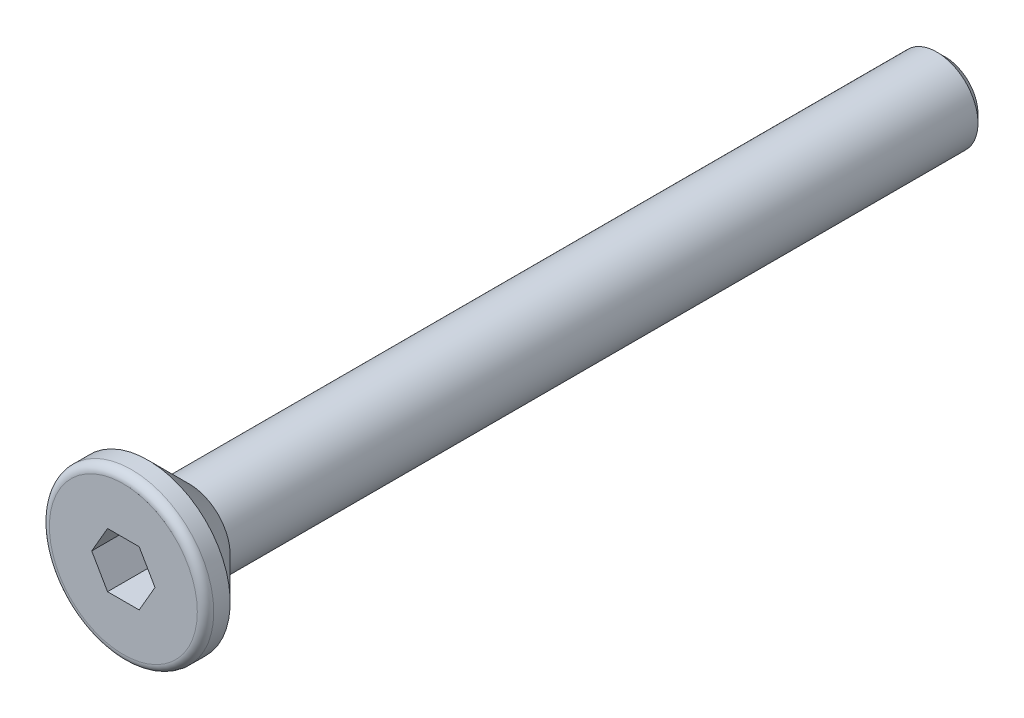
ISO-10303-21;
HEADER;
FILE_DESCRIPTION(('STEP AP214'),'2;1');
FILE_NAME('part.step','',(''),(''),'','','');
FILE_SCHEMA(('AUTOMOTIVE_DESIGN { 1 0 10303 214 1 1 1 1 }'));
ENDSEC;
DATA;
#1=APPLICATION_CONTEXT('core data for automotive mechanical design processes');
#2=APPLICATION_PROTOCOL_DEFINITION('international standard','automotive_design',2000,#1);
#3=PRODUCT_CONTEXT('',#1,'mechanical');
#4=PRODUCT('Part','Part','',(#3));
#5=PRODUCT_RELATED_PRODUCT_CATEGORY('part','',(#4));
#6=PRODUCT_DEFINITION_FORMATION('','',#4);
#7=PRODUCT_DEFINITION_CONTEXT('part definition',#1,'design');
#8=PRODUCT_DEFINITION('design','',#6,#7);
#9=PRODUCT_DEFINITION_SHAPE('','',#8);
#10=(LENGTH_UNIT() NAMED_UNIT(*) SI_UNIT(.MILLI.,.METRE.));
#11=(NAMED_UNIT(*) PLANE_ANGLE_UNIT() SI_UNIT($,.RADIAN.));
#12=(NAMED_UNIT(*) SI_UNIT($,.STERADIAN.) SOLID_ANGLE_UNIT());
#13=UNCERTAINTY_MEASURE_WITH_UNIT(LENGTH_MEASURE(1.E-05),#10,'distance_accuracy_value','');
#14=(GEOMETRIC_REPRESENTATION_CONTEXT(3) GLOBAL_UNCERTAINTY_ASSIGNED_CONTEXT((#13)) GLOBAL_UNIT_ASSIGNED_CONTEXT((#10,
#11,#12)) REPRESENTATION_CONTEXT('',''));
#15=CARTESIAN_POINT('',(0.,0.,0.));
#16=DIRECTION('',(0.,0.,1.));
#17=DIRECTION('',(1.,0.,0.));
#18=AXIS2_PLACEMENT_3D('',#15,#16,#17);
#19=CARTESIAN_POINT('',(0.,0.,15.));
#20=DIRECTION('',(0.,0.,1.));
#21=DIRECTION('',(1.,0.,0.));
#22=AXIS2_PLACEMENT_3D('',#19,#20,#21);
#23=PLANE('',#22);
#24=CARTESIAN_POINT('',(0.,0.,15.));
#25=DIRECTION('',(0.,0.,1.));
#26=DIRECTION('',(1.,0.,0.));
#27=AXIS2_PLACEMENT_3D('',#24,#25,#26);
#28=CIRCLE('',#27,2.7);
#29=CARTESIAN_POINT('',(2.7,0.,15.));
#30=VERTEX_POINT('',#29);
#31=EDGE_CURVE('E11',#30,#30,#28,.T.);
#32=ORIENTED_EDGE('',*,*,#31,.T.);
#33=EDGE_LOOP('',(#32));
#34=FACE_BOUND('',#33,.T.);
#35=DIRECTION('',(0.5,0.866025403784439,0.));
#36=VECTOR('',#35,1.);
#37=CARTESIAN_POINT('',(0.577350269189626,-1.,15.));
#38=LINE('',#37,#36);
#39=CARTESIAN_POINT('',(0.577350269189626,-1.,15.));
#40=VERTEX_POINT('',#39);
#41=CARTESIAN_POINT('',(1.15470053837925,0.,15.));
#42=VERTEX_POINT('',#41);
#43=EDGE_CURVE('E50',#40,#42,#38,.T.);
#44=ORIENTED_EDGE('',*,*,#43,.F.);
#45=DIRECTION('',(1.,0.,0.));
#46=VECTOR('',#45,1.);
#47=CARTESIAN_POINT('',(-0.577350269189626,-1.,15.));
#48=LINE('',#47,#46);
#49=CARTESIAN_POINT('',(-0.577350269189626,-1.,15.));
#50=VERTEX_POINT('',#49);
#51=EDGE_CURVE('E133',#50,#40,#48,.T.);
#52=ORIENTED_EDGE('',*,*,#51,.F.);
#53=DIRECTION('',(0.5,-0.866025403784438,0.));
#54=VECTOR('',#53,1.);
#55=CARTESIAN_POINT('',(-1.15470053837925,0.,15.));
#56=LINE('',#55,#54);
#57=CARTESIAN_POINT('',(-1.15470053837925,0.,15.));
#58=VERTEX_POINT('',#57);
#59=EDGE_CURVE('E131',#58,#50,#56,.T.);
#60=ORIENTED_EDGE('',*,*,#59,.F.);
#61=DIRECTION('',(-0.5,-0.866025403784439,0.));
#62=VECTOR('',#61,1.);
#63=CARTESIAN_POINT('',(-0.577350269189626,1.,15.));
#64=LINE('',#63,#62);
#65=CARTESIAN_POINT('',(-0.577350269189626,1.,15.));
#66=VERTEX_POINT('',#65);
#67=EDGE_CURVE('E98',#66,#58,#64,.T.);
#68=ORIENTED_EDGE('',*,*,#67,.F.);
#69=DIRECTION('',(-1.,0.,0.));
#70=VECTOR('',#69,1.);
#71=CARTESIAN_POINT('',(0.577350269189626,1.,15.));
#72=LINE('',#71,#70);
#73=CARTESIAN_POINT('',(0.577350269189626,1.,15.));
#74=VERTEX_POINT('',#73);
#75=EDGE_CURVE('E127',#74,#66,#72,.T.);
#76=ORIENTED_EDGE('',*,*,#75,.F.);
#77=DIRECTION('',(-0.5,0.866025403784438,0.));
#78=VECTOR('',#77,1.);
#79=CARTESIAN_POINT('',(1.15470053837925,0.,15.));
#80=LINE('',#79,#78);
#81=EDGE_CURVE('E124',#42,#74,#80,.T.);
#82=ORIENTED_EDGE('',*,*,#81,.F.);
#83=EDGE_LOOP('',(#44,#52,#60,#68,#76,#82));
#84=FACE_BOUND('',#83,.T.);
#85=ADVANCED_FACE('F35',(#34,#84),#23,.T.);
#86=CARTESIAN_POINT('',(0.,0.,-15.));
#87=DIRECTION('',(0.,0.,-1.));
#88=DIRECTION('',(-1.,0.,0.));
#89=AXIS2_PLACEMENT_3D('',#86,#87,#88);
#90=CYLINDRICAL_SURFACE('',#89,3.);
#91=CARTESIAN_POINT('',(0.,0.,14.7));
#92=DIRECTION('',(0.,0.,1.));
#93=DIRECTION('',(1.,0.,0.));
#94=AXIS2_PLACEMENT_3D('',#91,#92,#93);
#95=CIRCLE('',#94,3.);
#96=CARTESIAN_POINT('',(3.,0.,14.7));
#97=VERTEX_POINT('',#96);
#98=EDGE_CURVE('E43',#97,#97,#95,.F.);
#99=ORIENTED_EDGE('',*,*,#98,.T.);
#100=EDGE_LOOP('',(#99));
#101=FACE_BOUND('',#100,.T.);
#102=CARTESIAN_POINT('',(0.,0.,14.1));
#103=DIRECTION('',(0.,0.,-1.));
#104=DIRECTION('',(-1.,0.,0.));
#105=AXIS2_PLACEMENT_3D('',#102,#103,#104);
#106=CIRCLE('',#105,3.);
#107=CARTESIAN_POINT('',(-3.,0.,14.1));
#108=VERTEX_POINT('',#107);
#109=EDGE_CURVE('E151',#108,#108,#106,.T.);
#110=ORIENTED_EDGE('',*,*,#109,.F.);
#111=EDGE_LOOP('',(#110));
#112=FACE_BOUND('',#111,.T.);
#113=ADVANCED_FACE('F156',(#101,#112),#90,.T.);
#114=CARTESIAN_POINT('',(0.,0.,12.6));
#115=DIRECTION('',(0.,0.,1.));
#116=DIRECTION('',(1.,0.,0.));
#117=AXIS2_PLACEMENT_3D('',#114,#115,#116);
#118=CONICAL_SURFACE('',#117,1.5,0.785398163397443);
#119=ORIENTED_EDGE('',*,*,#109,.T.);
#120=EDGE_LOOP('',(#119));
#121=FACE_BOUND('',#120,.T.);
#122=CARTESIAN_POINT('',(0.,0.,12.6));
#123=DIRECTION('',(0.,0.,-1.));
#124=DIRECTION('',(-1.,0.,0.));
#125=AXIS2_PLACEMENT_3D('',#122,#123,#124);
#126=CIRCLE('',#125,1.5);
#127=CARTESIAN_POINT('',(-1.5,0.,12.6));
#128=VERTEX_POINT('',#127);
#129=EDGE_CURVE('E148',#128,#128,#126,.T.);
#130=ORIENTED_EDGE('',*,*,#129,.F.);
#131=EDGE_LOOP('',(#130));
#132=FACE_BOUND('',#131,.T.);
#133=ADVANCED_FACE('F172',(#121,#132),#118,.T.);
#134=CARTESIAN_POINT('',(0.,0.,-15.));
#135=DIRECTION('',(0.,0.,-1.));
#136=DIRECTION('',(-1.,0.,0.));
#137=AXIS2_PLACEMENT_3D('',#134,#135,#136);
#138=CYLINDRICAL_SURFACE('',#137,1.5);
#139=ORIENTED_EDGE('',*,*,#129,.T.);
#140=EDGE_LOOP('',(#139));
#141=FACE_BOUND('',#140,.T.);
#142=CARTESIAN_POINT('',(0.,0.,-14.7));
#143=DIRECTION('',(0.,0.,-1.));
#144=DIRECTION('',(-1.,0.,0.));
#145=AXIS2_PLACEMENT_3D('',#142,#143,#144);
#146=CIRCLE('',#145,1.5);
#147=CARTESIAN_POINT('',(-1.5,0.,-14.7));
#148=VERTEX_POINT('',#147);
#149=EDGE_CURVE('E145',#148,#148,#146,.T.);
#150=ORIENTED_EDGE('',*,*,#149,.F.);
#151=EDGE_LOOP('',(#150));
#152=FACE_BOUND('',#151,.T.);
#153=ADVANCED_FACE('F178',(#141,#152),#138,.T.);
#154=CARTESIAN_POINT('',(0.,0.,-15.));
#155=DIRECTION('',(0.,0.,1.));
#156=DIRECTION('',(1.,0.,0.));
#157=AXIS2_PLACEMENT_3D('',#154,#155,#156);
#158=CONICAL_SURFACE('',#157,1.20000000000001,0.785398163397443);
#159=ORIENTED_EDGE('',*,*,#149,.T.);
#160=EDGE_LOOP('',(#159));
#161=FACE_BOUND('',#160,.T.);
#162=CARTESIAN_POINT('',(0.,0.,-15.));
#163=DIRECTION('',(0.,0.,-1.));
#164=DIRECTION('',(-1.,0.,0.));
#165=AXIS2_PLACEMENT_3D('',#162,#163,#164);
#166=CIRCLE('',#165,1.20000000000001);
#167=CARTESIAN_POINT('',(-1.20000000000001,0.,-15.));
#168=VERTEX_POINT('',#167);
#169=EDGE_CURVE('E137',#168,#168,#166,.T.);
#170=ORIENTED_EDGE('',*,*,#169,.F.);
#171=EDGE_LOOP('',(#170));
#172=FACE_BOUND('',#171,.T.);
#173=ADVANCED_FACE('F182',(#161,#172),#158,.T.);
#174=CARTESIAN_POINT('',(0.,1.2,-15.));
#175=DIRECTION('',(0.,0.,-1.));
#176=DIRECTION('',(-1.,0.,0.));
#177=AXIS2_PLACEMENT_3D('',#174,#175,#176);
#178=PLANE('',#177);
#179=ORIENTED_EDGE('',*,*,#169,.T.);
#180=EDGE_LOOP('',(#179));
#181=FACE_BOUND('',#180,.T.);
#182=ADVANCED_FACE('F186',(#181),#178,.T.);
#183=CARTESIAN_POINT('',(0.577350269189626,-1.,13.5));
#184=DIRECTION('',(0.866025403784438,-0.5,0.));
#185=DIRECTION('',(0.5,0.866025403784439,0.));
#186=AXIS2_PLACEMENT_3D('',#183,#184,#185);
#187=PLANE('',#186);
#188=ORIENTED_EDGE('',*,*,#43,.T.);
#189=DIRECTION('',(0.,0.,1.));
#190=VECTOR('',#189,1.);
#191=CARTESIAN_POINT('',(1.15470053837925,0.,13.5));
#192=LINE('',#191,#190);
#193=CARTESIAN_POINT('',(1.15470053837925,0.,13.5));
#194=VERTEX_POINT('',#193);
#195=EDGE_CURVE('E80',#194,#42,#192,.T.);
#196=ORIENTED_EDGE('',*,*,#195,.F.);
#197=DIRECTION('',(0.5,0.866025403784439,0.));
#198=VECTOR('',#197,1.);
#199=CARTESIAN_POINT('',(0.577350269189626,-1.,13.5));
#200=LINE('',#199,#198);
#201=CARTESIAN_POINT('',(0.577350269189626,-1.,13.5));
#202=VERTEX_POINT('',#201);
#203=EDGE_CURVE('E135',#202,#194,#200,.T.);
#204=ORIENTED_EDGE('',*,*,#203,.F.);
#205=DIRECTION('',(0.,0.,1.));
#206=VECTOR('',#205,1.);
#207=CARTESIAN_POINT('',(0.577350269189626,-1.,13.5));
#208=LINE('',#207,#206);
#209=EDGE_CURVE('E58',#202,#40,#208,.T.);
#210=ORIENTED_EDGE('',*,*,#209,.T.);
#211=EDGE_LOOP('',(#188,#196,#204,#210));
#212=FACE_BOUND('',#211,.T.);
#213=ADVANCED_FACE('F190',(#212),#187,.F.);
#214=CARTESIAN_POINT('',(-0.577350269189626,-1.,13.5));
#215=DIRECTION('',(0.,-1.,0.));
#216=DIRECTION('',(1.,0.,0.));
#217=AXIS2_PLACEMENT_3D('',#214,#215,#216);
#218=PLANE('',#217);
#219=ORIENTED_EDGE('',*,*,#51,.T.);
#220=ORIENTED_EDGE('',*,*,#209,.F.);
#221=DIRECTION('',(1.,0.,0.));
#222=VECTOR('',#221,1.);
#223=CARTESIAN_POINT('',(-0.577350269189626,-1.,13.5));
#224=LINE('',#223,#222);
#225=CARTESIAN_POINT('',(-0.577350269189626,-1.,13.5));
#226=VERTEX_POINT('',#225);
#227=EDGE_CURVE('E110',#226,#202,#224,.T.);
#228=ORIENTED_EDGE('',*,*,#227,.F.);
#229=DIRECTION('',(0.,0.,1.));
#230=VECTOR('',#229,1.);
#231=CARTESIAN_POINT('',(-0.577350269189626,-1.,13.5));
#232=LINE('',#231,#230);
#233=EDGE_CURVE('E102',#226,#50,#232,.T.);
#234=ORIENTED_EDGE('',*,*,#233,.T.);
#235=EDGE_LOOP('',(#219,#220,#228,#234));
#236=FACE_BOUND('',#235,.T.);
#237=ADVANCED_FACE('F194',(#236),#218,.F.);
#238=CARTESIAN_POINT('',(-1.15470053837925,0.,13.5));
#239=DIRECTION('',(-0.866025403784439,-0.5,0.));
#240=DIRECTION('',(0.5,-0.866025403784439,0.));
#241=AXIS2_PLACEMENT_3D('',#238,#239,#240);
#242=PLANE('',#241);
#243=ORIENTED_EDGE('',*,*,#59,.T.);
#244=ORIENTED_EDGE('',*,*,#233,.F.);
#245=DIRECTION('',(0.5,-0.866025403784438,0.));
#246=VECTOR('',#245,1.);
#247=CARTESIAN_POINT('',(-1.15470053837925,0.,13.5));
#248=LINE('',#247,#246);
#249=CARTESIAN_POINT('',(-1.15470053837925,0.,13.5));
#250=VERTEX_POINT('',#249);
#251=EDGE_CURVE('E106',#250,#226,#248,.T.);
#252=ORIENTED_EDGE('',*,*,#251,.F.);
#253=DIRECTION('',(0.,0.,1.));
#254=VECTOR('',#253,1.);
#255=CARTESIAN_POINT('',(-1.15470053837925,0.,13.5));
#256=LINE('',#255,#254);
#257=EDGE_CURVE('E91',#250,#58,#256,.T.);
#258=ORIENTED_EDGE('',*,*,#257,.T.);
#259=EDGE_LOOP('',(#243,#244,#252,#258));
#260=FACE_BOUND('',#259,.T.);
#261=ADVANCED_FACE('F107',(#260),#242,.F.);
#262=CARTESIAN_POINT('',(-0.577350269189626,1.,13.5));
#263=DIRECTION('',(-0.866025403784439,0.5,0.));
#264=DIRECTION('',(-0.5,-0.866025403784439,0.));
#265=AXIS2_PLACEMENT_3D('',#262,#263,#264);
#266=PLANE('',#265);
#267=ORIENTED_EDGE('',*,*,#67,.T.);
#268=ORIENTED_EDGE('',*,*,#257,.F.);
#269=DIRECTION('',(-0.5,-0.866025403784439,0.));
#270=VECTOR('',#269,1.);
#271=CARTESIAN_POINT('',(-0.577350269189626,1.,13.5));
#272=LINE('',#271,#270);
#273=CARTESIAN_POINT('',(-0.577350269189626,1.,13.5));
#274=VERTEX_POINT('',#273);
#275=EDGE_CURVE('E95',#274,#250,#272,.T.);
#276=ORIENTED_EDGE('',*,*,#275,.F.);
#277=DIRECTION('',(0.,0.,1.));
#278=VECTOR('',#277,1.);
#279=CARTESIAN_POINT('',(-0.577350269189626,1.,13.5));
#280=LINE('',#279,#278);
#281=EDGE_CURVE('E103',#274,#66,#280,.T.);
#282=ORIENTED_EDGE('',*,*,#281,.T.);
#283=EDGE_LOOP('',(#267,#268,#276,#282));
#284=FACE_BOUND('',#283,.T.);
#285=ADVANCED_FACE('F93',(#284),#266,.F.);
#286=CARTESIAN_POINT('',(0.577350269189626,1.,13.5));
#287=DIRECTION('',(0.,1.,0.));
#288=DIRECTION('',(-1.,0.,0.));
#289=AXIS2_PLACEMENT_3D('',#286,#287,#288);
#290=PLANE('',#289);
#291=ORIENTED_EDGE('',*,*,#75,.T.);
#292=ORIENTED_EDGE('',*,*,#281,.F.);
#293=DIRECTION('',(-1.,0.,0.));
#294=VECTOR('',#293,1.);
#295=CARTESIAN_POINT('',(0.577350269189626,1.,13.5));
#296=LINE('',#295,#294);
#297=CARTESIAN_POINT('',(0.577350269189626,1.,13.5));
#298=VERTEX_POINT('',#297);
#299=EDGE_CURVE('E116',#298,#274,#296,.T.);
#300=ORIENTED_EDGE('',*,*,#299,.F.);
#301=DIRECTION('',(0.,0.,1.));
#302=VECTOR('',#301,1.);
#303=CARTESIAN_POINT('',(0.577350269189626,1.,13.5));
#304=LINE('',#303,#302);
#305=EDGE_CURVE('E140',#298,#74,#304,.T.);
#306=ORIENTED_EDGE('',*,*,#305,.T.);
#307=EDGE_LOOP('',(#291,#292,#300,#306));
#308=FACE_BOUND('',#307,.T.);
#309=ADVANCED_FACE('F197',(#308),#290,.F.);
#310=CARTESIAN_POINT('',(1.15470053837925,0.,13.5));
#311=DIRECTION('',(0.866025403784439,0.5,0.));
#312=DIRECTION('',(-0.5,0.866025403784439,0.));
#313=AXIS2_PLACEMENT_3D('',#310,#311,#312);
#314=PLANE('',#313);
#315=ORIENTED_EDGE('',*,*,#81,.T.);
#316=ORIENTED_EDGE('',*,*,#305,.F.);
#317=DIRECTION('',(-0.5,0.866025403784438,0.));
#318=VECTOR('',#317,1.);
#319=CARTESIAN_POINT('',(1.15470053837925,0.,13.5));
#320=LINE('',#319,#318);
#321=EDGE_CURVE('E118',#194,#298,#320,.T.);
#322=ORIENTED_EDGE('',*,*,#321,.F.);
#323=ORIENTED_EDGE('',*,*,#195,.T.);
#324=EDGE_LOOP('',(#315,#316,#322,#323));
#325=FACE_BOUND('',#324,.T.);
#326=ADVANCED_FACE('F164',(#325),#314,.F.);
#327=CARTESIAN_POINT('',(0.,0.,13.5));
#328=DIRECTION('',(0.,0.,1.));
#329=DIRECTION('',(1.,0.,0.));
#330=AXIS2_PLACEMENT_3D('',#327,#328,#329);
#331=PLANE('',#330);
#332=ORIENTED_EDGE('',*,*,#203,.T.);
#333=ORIENTED_EDGE('',*,*,#321,.T.);
#334=ORIENTED_EDGE('',*,*,#299,.T.);
#335=ORIENTED_EDGE('',*,*,#275,.T.);
#336=ORIENTED_EDGE('',*,*,#251,.T.);
#337=ORIENTED_EDGE('',*,*,#227,.T.);
#338=EDGE_LOOP('',(#332,#333,#334,#335,#336,#337));
#339=FACE_BOUND('',#338,.T.);
#340=ADVANCED_FACE('F113',(#339),#331,.T.);
#341=CARTESIAN_POINT('',(0.,0.,14.7));
#342=DIRECTION('',(0.,0.,1.));
#343=DIRECTION('',(1.,0.,0.));
#344=AXIS2_PLACEMENT_3D('',#341,#342,#343);
#345=TOROIDAL_SURFACE('',#344,2.7,0.3);
#346=ORIENTED_EDGE('',*,*,#31,.F.);
#347=EDGE_LOOP('',(#346));
#348=FACE_BOUND('',#347,.T.);
#349=ORIENTED_EDGE('',*,*,#98,.F.);
#350=EDGE_LOOP('',(#349));
#351=FACE_BOUND('',#350,.T.);
#352=ADVANCED_FACE('F37',(#348,#351),#345,.T.);
#353=CLOSED_SHELL('',(#85,#113,#133,#153,#173,#182,#213,#237,#261,#285,#309,#326,#340,#352));
#354=MANIFOLD_SOLID_BREP('B2',#353);
#355=ADVANCED_BREP_SHAPE_REPRESENTATION('',(#18,#354),#14);
#356=SHAPE_DEFINITION_REPRESENTATION(#9,#355);
ENDSEC;
END-ISO-10303-21;
